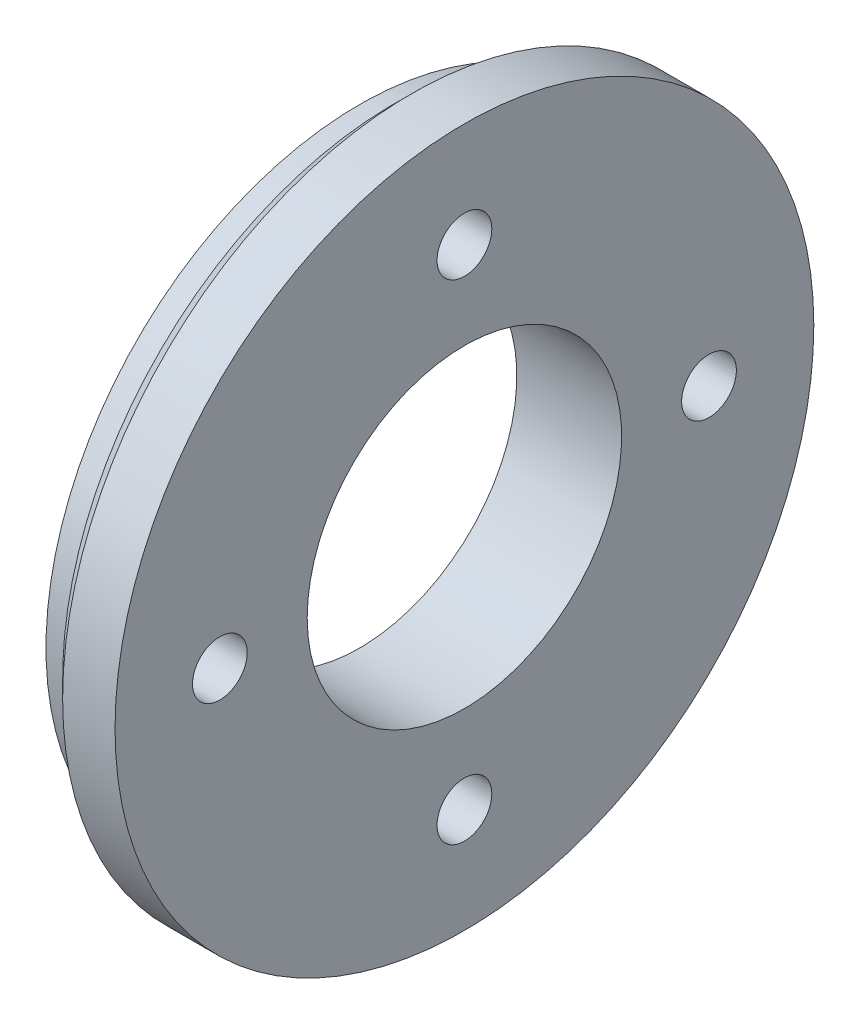
ISO-10303-21;
HEADER;
FILE_DESCRIPTION(('STEP AP214'),'2;1');
FILE_NAME('part.step','',(''),(''),'','','');
FILE_SCHEMA(('AUTOMOTIVE_DESIGN { 1 0 10303 214 1 1 1 1 }'));
ENDSEC;
DATA;
#1=APPLICATION_CONTEXT('core data for automotive mechanical design processes');
#2=APPLICATION_PROTOCOL_DEFINITION('international standard','automotive_design',2000,#1);
#3=PRODUCT_CONTEXT('',#1,'mechanical');
#4=PRODUCT('Part','Part','',(#3));
#5=PRODUCT_RELATED_PRODUCT_CATEGORY('part','',(#4));
#6=PRODUCT_DEFINITION_FORMATION('','',#4);
#7=PRODUCT_DEFINITION_CONTEXT('part definition',#1,'design');
#8=PRODUCT_DEFINITION('design','',#6,#7);
#9=PRODUCT_DEFINITION_SHAPE('','',#8);
#10=(LENGTH_UNIT() NAMED_UNIT(*) SI_UNIT(.MILLI.,.METRE.));
#11=(NAMED_UNIT(*) PLANE_ANGLE_UNIT() SI_UNIT($,.RADIAN.));
#12=(NAMED_UNIT(*) SI_UNIT($,.STERADIAN.) SOLID_ANGLE_UNIT());
#13=UNCERTAINTY_MEASURE_WITH_UNIT(LENGTH_MEASURE(1.E-05),#10,'distance_accuracy_value','');
#14=(GEOMETRIC_REPRESENTATION_CONTEXT(3) GLOBAL_UNCERTAINTY_ASSIGNED_CONTEXT((#13)) GLOBAL_UNIT_ASSIGNED_CONTEXT((#10,
#11,#12)) REPRESENTATION_CONTEXT('',''));
#15=CARTESIAN_POINT('',(0.,0.,0.));
#16=DIRECTION('',(0.,0.,1.));
#17=DIRECTION('',(1.,0.,0.));
#18=AXIS2_PLACEMENT_3D('',#15,#16,#17);
#19=CARTESIAN_POINT('',(-4.7625,0.,0.));
#20=DIRECTION('',(1.,0.,0.));
#21=DIRECTION('',(0.,0.,-1.));
#22=AXIS2_PLACEMENT_3D('',#19,#20,#21);
#23=PLANE('',#22);
#24=CARTESIAN_POINT('',(-4.7625,22.225,0.));
#25=DIRECTION('',(1.,0.,0.));
#26=DIRECTION('',(0.,0.,-1.));
#27=AXIS2_PLACEMENT_3D('',#24,#25,#26);
#28=CIRCLE('',#27,2.4892);
#29=CARTESIAN_POINT('',(-4.7625,22.225,-2.4892));
#30=VERTEX_POINT('',#29);
#31=EDGE_CURVE('E67',#30,#30,#28,.T.);
#32=ORIENTED_EDGE('',*,*,#31,.T.);
#33=EDGE_LOOP('',(#32));
#34=FACE_BOUND('',#33,.T.);
#35=CARTESIAN_POINT('',(-4.7625,0.,22.225));
#36=DIRECTION('',(1.,0.,0.));
#37=DIRECTION('',(0.,0.,-1.));
#38=AXIS2_PLACEMENT_3D('',#35,#36,#37);
#39=CIRCLE('',#38,2.4892);
#40=CARTESIAN_POINT('',(-4.7625,0.,19.7358));
#41=VERTEX_POINT('',#40);
#42=EDGE_CURVE('E85',#41,#41,#39,.T.);
#43=ORIENTED_EDGE('',*,*,#42,.T.);
#44=EDGE_LOOP('',(#43));
#45=FACE_BOUND('',#44,.T.);
#46=CARTESIAN_POINT('',(-4.7625,-22.225,0.));
#47=DIRECTION('',(1.,0.,0.));
#48=DIRECTION('',(0.,0.,-1.));
#49=AXIS2_PLACEMENT_3D('',#46,#47,#48);
#50=CIRCLE('',#49,2.4892);
#51=CARTESIAN_POINT('',(-4.7625,-22.225,-2.4892));
#52=VERTEX_POINT('',#51);
#53=EDGE_CURVE('E79',#52,#52,#50,.T.);
#54=ORIENTED_EDGE('',*,*,#53,.T.);
#55=EDGE_LOOP('',(#54));
#56=FACE_BOUND('',#55,.T.);
#57=CARTESIAN_POINT('',(-4.7625,0.,-22.225));
#58=DIRECTION('',(1.,0.,0.));
#59=DIRECTION('',(0.,0.,-1.));
#60=AXIS2_PLACEMENT_3D('',#57,#58,#59);
#61=CIRCLE('',#60,2.4892);
#62=CARTESIAN_POINT('',(-4.7625,0.,-24.7142));
#63=VERTEX_POINT('',#62);
#64=EDGE_CURVE('E73',#63,#63,#61,.T.);
#65=ORIENTED_EDGE('',*,*,#64,.T.);
#66=EDGE_LOOP('',(#65));
#67=FACE_BOUND('',#66,.T.);
#68=CARTESIAN_POINT('',(-4.7625,0.,0.));
#69=DIRECTION('',(1.,0.,0.));
#70=DIRECTION('',(0.,0.,-1.));
#71=AXIS2_PLACEMENT_3D('',#68,#69,#70);
#72=CIRCLE('',#71,14.2875);
#73=CARTESIAN_POINT('',(-4.7625,0.,14.2875));
#74=VERTEX_POINT('',#73);
#75=EDGE_CURVE('E58',#74,#74,#72,.T.);
#76=ORIENTED_EDGE('',*,*,#75,.T.);
#77=EDGE_LOOP('',(#76));
#78=FACE_BOUND('',#77,.T.);
#79=CARTESIAN_POINT('',(-4.7625,0.,0.));
#80=DIRECTION('',(1.,0.,0.));
#81=DIRECTION('',(0.,0.,-1.));
#82=AXIS2_PLACEMENT_3D('',#79,#80,#81);
#83=CIRCLE('',#82,28.4988);
#84=CARTESIAN_POINT('',(-4.7625,0.,-28.4988));
#85=VERTEX_POINT('',#84);
#86=EDGE_CURVE('E64',#85,#85,#83,.T.);
#87=ORIENTED_EDGE('',*,*,#86,.F.);
#88=EDGE_LOOP('',(#87));
#89=FACE_BOUND('',#88,.T.);
#90=ADVANCED_FACE('F39',(#34,#45,#56,#67,#78,#89),#23,.F.);
#91=CARTESIAN_POINT('',(4.7625,0.,0.));
#92=DIRECTION('',(1.,0.,0.));
#93=DIRECTION('',(0.,0.,-1.));
#94=AXIS2_PLACEMENT_3D('',#91,#92,#93);
#95=PLANE('',#94);
#96=CARTESIAN_POINT('',(4.7625,22.225,0.));
#97=DIRECTION('',(1.,0.,0.));
#98=DIRECTION('',(0.,0.,-1.));
#99=AXIS2_PLACEMENT_3D('',#96,#97,#98);
#100=CIRCLE('',#99,2.4892);
#101=CARTESIAN_POINT('',(4.7625,22.225,-2.4892));
#102=VERTEX_POINT('',#101);
#103=EDGE_CURVE('E88',#102,#102,#100,.T.);
#104=ORIENTED_EDGE('',*,*,#103,.F.);
#105=EDGE_LOOP('',(#104));
#106=FACE_BOUND('',#105,.T.);
#107=CARTESIAN_POINT('',(4.7625,0.,22.225));
#108=DIRECTION('',(1.,0.,0.));
#109=DIRECTION('',(0.,0.,-1.));
#110=AXIS2_PLACEMENT_3D('',#107,#108,#109);
#111=CIRCLE('',#110,2.4892);
#112=CARTESIAN_POINT('',(4.7625,0.,19.7358));
#113=VERTEX_POINT('',#112);
#114=EDGE_CURVE('E82',#113,#113,#111,.T.);
#115=ORIENTED_EDGE('',*,*,#114,.F.);
#116=EDGE_LOOP('',(#115));
#117=FACE_BOUND('',#116,.T.);
#118=CARTESIAN_POINT('',(4.7625,-22.225,0.));
#119=DIRECTION('',(1.,0.,0.));
#120=DIRECTION('',(0.,0.,-1.));
#121=AXIS2_PLACEMENT_3D('',#118,#119,#120);
#122=CIRCLE('',#121,2.4892);
#123=CARTESIAN_POINT('',(4.7625,-22.225,-2.4892));
#124=VERTEX_POINT('',#123);
#125=EDGE_CURVE('E76',#124,#124,#122,.T.);
#126=ORIENTED_EDGE('',*,*,#125,.F.);
#127=EDGE_LOOP('',(#126));
#128=FACE_BOUND('',#127,.T.);
#129=CARTESIAN_POINT('',(4.7625,0.,-22.225));
#130=DIRECTION('',(1.,0.,0.));
#131=DIRECTION('',(0.,0.,-1.));
#132=AXIS2_PLACEMENT_3D('',#129,#130,#131);
#133=CIRCLE('',#132,2.4892);
#134=CARTESIAN_POINT('',(4.7625,0.,-24.7142));
#135=VERTEX_POINT('',#134);
#136=EDGE_CURVE('E70',#135,#135,#133,.T.);
#137=ORIENTED_EDGE('',*,*,#136,.F.);
#138=EDGE_LOOP('',(#137));
#139=FACE_BOUND('',#138,.T.);
#140=CARTESIAN_POINT('',(4.7625,0.,0.));
#141=DIRECTION('',(1.,0.,0.));
#142=DIRECTION('',(0.,0.,-1.));
#143=AXIS2_PLACEMENT_3D('',#140,#141,#142);
#144=CIRCLE('',#143,31.75);
#145=CARTESIAN_POINT('',(4.7625,0.,31.75));
#146=VERTEX_POINT('',#145);
#147=EDGE_CURVE('E51',#146,#146,#144,.T.);
#148=ORIENTED_EDGE('',*,*,#147,.T.);
#149=EDGE_LOOP('',(#148));
#150=FACE_BOUND('',#149,.T.);
#151=CARTESIAN_POINT('',(4.7625,0.,0.));
#152=DIRECTION('',(1.,0.,0.));
#153=DIRECTION('',(0.,0.,-1.));
#154=AXIS2_PLACEMENT_3D('',#151,#152,#153);
#155=CIRCLE('',#154,14.2875);
#156=CARTESIAN_POINT('',(4.7625,0.,14.2875));
#157=VERTEX_POINT('',#156);
#158=EDGE_CURVE('E55',#157,#157,#155,.T.);
#159=ORIENTED_EDGE('',*,*,#158,.F.);
#160=EDGE_LOOP('',(#159));
#161=FACE_BOUND('',#160,.T.);
#162=ADVANCED_FACE('F103',(#106,#117,#128,#139,#150,#161),#95,.T.);
#163=CARTESIAN_POINT('',(4.7625,0.,0.));
#164=DIRECTION('',(-1.,0.,0.));
#165=DIRECTION('',(0.,0.,1.));
#166=AXIS2_PLACEMENT_3D('',#163,#164,#165);
#167=CYLINDRICAL_SURFACE('',#166,31.75);
#168=CARTESIAN_POINT('',(0.,0.,0.));
#169=DIRECTION('',(1.,0.,0.));
#170=DIRECTION('',(0.,0.,-1.));
#171=AXIS2_PLACEMENT_3D('',#168,#169,#170);
#172=CIRCLE('',#171,31.75);
#173=CARTESIAN_POINT('',(0.,0.,31.75));
#174=VERTEX_POINT('',#173);
#175=EDGE_CURVE('E47',#174,#174,#172,.T.);
#176=CARTESIAN_POINT('',(0.,0.,31.75));
#177=CARTESIAN_POINT('',(0.0496093750000188,0.,31.75));
#178=CARTESIAN_POINT('',(0.0992187500000186,0.,31.75));
#179=CARTESIAN_POINT('',(0.198437500000018,0.,31.75));
#180=CARTESIAN_POINT('',(0.248046875000018,0.,31.75));
#181=CARTESIAN_POINT('',(0.347265625000018,0.,31.75));
#182=CARTESIAN_POINT('',(0.396875000000018,0.,31.75));
#183=CARTESIAN_POINT('',(0.496093750000017,0.,31.75));
#184=CARTESIAN_POINT('',(0.545703125000017,0.,31.75));
#185=CARTESIAN_POINT('',(0.644921875000017,0.,31.75));
#186=CARTESIAN_POINT('',(0.694531250000016,0.,31.75));
#187=CARTESIAN_POINT('',(0.793750000000016,0.,31.75));
#188=CARTESIAN_POINT('',(0.843359375000015,0.,31.75));
#189=CARTESIAN_POINT('',(0.942578125000015,0.,31.75));
#190=CARTESIAN_POINT('',(0.992187500000015,0.,31.75));
#191=CARTESIAN_POINT('',(1.09140625000001,0.,31.75));
#192=CARTESIAN_POINT('',(1.14101562500001,0.,31.75));
#193=CARTESIAN_POINT('',(1.24023437500001,0.,31.75));
#194=CARTESIAN_POINT('',(1.28984375000001,0.,31.75));
#195=CARTESIAN_POINT('',(1.38906250000001,0.,31.75));
#196=CARTESIAN_POINT('',(1.43867187500001,0.,31.75));
#197=CARTESIAN_POINT('',(1.53789062500001,0.,31.75));
#198=CARTESIAN_POINT('',(1.58750000000001,0.,31.75));
#199=CARTESIAN_POINT('',(1.68671875000001,0.,31.75));
#200=CARTESIAN_POINT('',(1.73632812500001,0.,31.75));
#201=CARTESIAN_POINT('',(1.83554687500001,0.,31.75));
#202=CARTESIAN_POINT('',(1.88515625000001,0.,31.75));
#203=CARTESIAN_POINT('',(1.98437500000001,0.,31.75));
#204=CARTESIAN_POINT('',(2.03398437500001,0.,31.75));
#205=CARTESIAN_POINT('',(2.13320312500001,0.,31.75));
#206=CARTESIAN_POINT('',(2.18281250000001,0.,31.75));
#207=CARTESIAN_POINT('',(2.28203125000001,0.,31.75));
#208=CARTESIAN_POINT('',(2.33164062500001,0.,31.75));
#209=CARTESIAN_POINT('',(2.43085937500001,0.,31.75));
#210=CARTESIAN_POINT('',(2.48046875000001,0.,31.75));
#211=CARTESIAN_POINT('',(2.57968750000001,0.,31.75));
#212=CARTESIAN_POINT('',(2.62929687500001,0.,31.75));
#213=CARTESIAN_POINT('',(2.72851562500001,0.,31.75));
#214=CARTESIAN_POINT('',(2.77812500000001,0.,31.75));
#215=CARTESIAN_POINT('',(2.87734375000001,0.,31.75));
#216=CARTESIAN_POINT('',(2.92695312500001,0.,31.75));
#217=CARTESIAN_POINT('',(3.02617187500001,0.,31.75));
#218=CARTESIAN_POINT('',(3.07578125000001,0.,31.75));
#219=CARTESIAN_POINT('',(3.17500000000001,0.,31.75));
#220=CARTESIAN_POINT('',(3.22460937500001,0.,31.75));
#221=CARTESIAN_POINT('',(3.32382812500001,0.,31.75));
#222=CARTESIAN_POINT('',(3.3734375,0.,31.75));
#223=CARTESIAN_POINT('',(3.47265625,0.,31.75));
#224=CARTESIAN_POINT('',(3.522265625,0.,31.75));
#225=CARTESIAN_POINT('',(3.621484375,0.,31.75));
#226=CARTESIAN_POINT('',(3.67109375,0.,31.75));
#227=CARTESIAN_POINT('',(3.7703125,0.,31.75));
#228=CARTESIAN_POINT('',(3.819921875,0.,31.75));
#229=CARTESIAN_POINT('',(3.919140625,0.,31.75));
#230=CARTESIAN_POINT('',(3.96875,0.,31.75));
#231=CARTESIAN_POINT('',(4.06796875,0.,31.75));
#232=CARTESIAN_POINT('',(4.117578125,0.,31.75));
#233=CARTESIAN_POINT('',(4.216796875,0.,31.75));
#234=CARTESIAN_POINT('',(4.26640625,0.,31.75));
#235=CARTESIAN_POINT('',(4.365625,0.,31.75));
#236=CARTESIAN_POINT('',(4.415234375,0.,31.75));
#237=CARTESIAN_POINT('',(4.514453125,0.,31.75));
#238=CARTESIAN_POINT('',(4.5640625,0.,31.75));
#239=CARTESIAN_POINT('',(4.66328125,0.,31.75));
#240=CARTESIAN_POINT('',(4.712890625,0.,31.75));
#241=CARTESIAN_POINT('',(4.7625,0.,31.75));
#242=B_SPLINE_CURVE_WITH_KNOTS('',3,(#176,#177,#178,#179,#180,#181,#182,#183,#184,#185,#186,
#187,#188,#189,#190,#191,#192,#193,#194,#195,#196,#197,#198,#199,#200,#201,#202,#203,#204,#205,
#206,#207,#208,#209,#210,#211,#212,#213,#214,#215,#216,#217,#218,#219,#220,#221,#222,#223,#224,
#225,#226,#227,#228,#229,#230,#231,#232,#233,#234,#235,#236,#237,#238,#239,#240,#241),
.UNSPECIFIED.,.F.,.F.,(4,2,2,2,2,2,2,2,2,2,2,2,2,2,2,2,2,2,2,2,2,2,2,2,2,2,2,2,2,2,2,2,4),(0.,
0.148828124999999,0.297656249999998,0.446484374999999,0.595312499999998,0.744140624999997,
0.892968749999996,1.041796875,1.190625,1.33945312499999,1.48828124999999,1.63710937499999,
1.78593749999999,1.93476562499999,2.08359374999999,2.23242187499999,2.38124999999999,
2.53007812499999,2.67890624999999,2.82773437499999,2.97656249999999,3.12539062499999,
3.27421874999999,3.42304687499999,3.57187499999998,3.72070312499998,3.86953124999998,
4.01835937499998,4.16718749999998,4.31601562499998,4.46484374999998,4.61367187499998,
4.76249999999998),.UNSPECIFIED.);
#243=EDGE_CURVE('BSEAM106',#174,#146,#242,.T.);
#244=ORIENTED_EDGE('',*,*,#175,.T.);
#245=ORIENTED_EDGE('',*,*,#147,.F.);
#246=ORIENTED_EDGE('',*,*,#243,.T.);
#247=ORIENTED_EDGE('',*,*,#243,.F.);
#248=EDGE_LOOP('',(#244,#246,#245,#247));
#249=FACE_BOUND('',#248,.T.);
#250=ADVANCED_FACE('F106',(#249),#167,.T.);
#251=CARTESIAN_POINT('',(4.7625,0.,0.));
#252=DIRECTION('',(-1.,0.,0.));
#253=DIRECTION('',(0.,0.,1.));
#254=AXIS2_PLACEMENT_3D('',#251,#252,#253);
#255=CYLINDRICAL_SURFACE('',#254,14.2875);
#256=CARTESIAN_POINT('',(4.7625,0.,14.2875));
#257=CARTESIAN_POINT('',(4.66328125,0.,14.2875));
#258=CARTESIAN_POINT('',(4.5640625,0.,14.2875));
#259=CARTESIAN_POINT('',(4.365625,0.,14.2875));
#260=CARTESIAN_POINT('',(4.26640625,0.,14.2875));
#261=CARTESIAN_POINT('',(4.06796875,0.,14.2875));
#262=CARTESIAN_POINT('',(3.96875,0.,14.2875));
#263=CARTESIAN_POINT('',(3.7703125,0.,14.2875));
#264=CARTESIAN_POINT('',(3.67109375,0.,14.2875));
#265=CARTESIAN_POINT('',(3.47265625,0.,14.2875));
#266=CARTESIAN_POINT('',(3.3734375,0.,14.2875));
#267=CARTESIAN_POINT('',(3.175,0.,14.2875));
#268=CARTESIAN_POINT('',(3.07578125,0.,14.2875));
#269=CARTESIAN_POINT('',(2.87734375,0.,14.2875));
#270=CARTESIAN_POINT('',(2.778125,0.,14.2875));
#271=CARTESIAN_POINT('',(2.5796875,0.,14.2875));
#272=CARTESIAN_POINT('',(2.48046875,0.,14.2875));
#273=CARTESIAN_POINT('',(2.28203125,0.,14.2875));
#274=CARTESIAN_POINT('',(2.1828125,0.,14.2875));
#275=CARTESIAN_POINT('',(1.984375,0.,14.2875));
#276=CARTESIAN_POINT('',(1.88515625,0.,14.2875));
#277=CARTESIAN_POINT('',(1.68671875,0.,14.2875));
#278=CARTESIAN_POINT('',(1.5875,0.,14.2875));
#279=CARTESIAN_POINT('',(1.3890625,0.,14.2875));
#280=CARTESIAN_POINT('',(1.28984375,0.,14.2875));
#281=CARTESIAN_POINT('',(1.09140625,0.,14.2875));
#282=CARTESIAN_POINT('',(0.992187499999999,0.,14.2875));
#283=CARTESIAN_POINT('',(0.79375,0.,14.2875));
#284=CARTESIAN_POINT('',(0.69453125,0.,14.2875));
#285=CARTESIAN_POINT('',(0.49609375,0.,14.2875));
#286=CARTESIAN_POINT('',(0.396875,0.,14.2875));
#287=CARTESIAN_POINT('',(0.1984375,0.,14.2875));
#288=CARTESIAN_POINT('',(0.0992187500000001,0.,14.2875));
#289=CARTESIAN_POINT('',(-0.0992187500000001,0.,14.2875));
#290=CARTESIAN_POINT('',(-0.1984375,0.,14.2875));
#291=CARTESIAN_POINT('',(-0.396875,0.,14.2875));
#292=CARTESIAN_POINT('',(-0.49609375,0.,14.2875));
#293=CARTESIAN_POINT('',(-0.69453125,0.,14.2875));
#294=CARTESIAN_POINT('',(-0.793750000000001,0.,14.2875));
#295=CARTESIAN_POINT('',(-0.992187500000001,0.,14.2875));
#296=CARTESIAN_POINT('',(-1.09140625,0.,14.2875));
#297=CARTESIAN_POINT('',(-1.28984375,0.,14.2875));
#298=CARTESIAN_POINT('',(-1.3890625,0.,14.2875));
#299=CARTESIAN_POINT('',(-1.5875,0.,14.2875));
#300=CARTESIAN_POINT('',(-1.68671875,0.,14.2875));
#301=CARTESIAN_POINT('',(-1.88515625,0.,14.2875));
#302=CARTESIAN_POINT('',(-1.984375,0.,14.2875));
#303=CARTESIAN_POINT('',(-2.1828125,0.,14.2875));
#304=CARTESIAN_POINT('',(-2.28203125,0.,14.2875));
#305=CARTESIAN_POINT('',(-2.48046875,0.,14.2875));
#306=CARTESIAN_POINT('',(-2.5796875,0.,14.2875));
#307=CARTESIAN_POINT('',(-2.778125,0.,14.2875));
#308=CARTESIAN_POINT('',(-2.87734375,0.,14.2875));
#309=CARTESIAN_POINT('',(-3.07578125,0.,14.2875));
#310=CARTESIAN_POINT('',(-3.175,0.,14.2875));
#311=CARTESIAN_POINT('',(-3.3734375,0.,14.2875));
#312=CARTESIAN_POINT('',(-3.47265625,0.,14.2875));
#313=CARTESIAN_POINT('',(-3.67109375,0.,14.2875));
#314=CARTESIAN_POINT('',(-3.7703125,0.,14.2875));
#315=CARTESIAN_POINT('',(-3.96875,0.,14.2875));
#316=CARTESIAN_POINT('',(-4.06796875,0.,14.2875));
#317=CARTESIAN_POINT('',(-4.26640625,0.,14.2875));
#318=CARTESIAN_POINT('',(-4.365625,0.,14.2875));
#319=CARTESIAN_POINT('',(-4.5640625,0.,14.2875));
#320=CARTESIAN_POINT('',(-4.66328125,0.,14.2875));
#321=CARTESIAN_POINT('',(-4.7625,0.,14.2875));
#322=B_SPLINE_CURVE_WITH_KNOTS('',3,(#256,#257,#258,#259,#260,#261,#262,#263,#264,#265,#266,
#267,#268,#269,#270,#271,#272,#273,#274,#275,#276,#277,#278,#279,#280,#281,#282,#283,#284,#285,
#286,#287,#288,#289,#290,#291,#292,#293,#294,#295,#296,#297,#298,#299,#300,#301,#302,#303,#304,
#305,#306,#307,#308,#309,#310,#311,#312,#313,#314,#315,#316,#317,#318,#319,#320,#321),
.UNSPECIFIED.,.F.,.F.,(4,2,2,2,2,2,2,2,2,2,2,2,2,2,2,2,2,2,2,2,2,2,2,2,2,2,2,2,2,2,2,2,4),(0.,
0.29765625,0.5953125,0.892968750000001,1.190625,1.48828125,1.7859375,2.08359375,2.38125,
2.67890625,2.9765625,3.27421875,3.571875,3.86953125,4.1671875,4.46484375,4.7625,5.06015625,
5.3578125,5.65546875,5.953125,6.25078125,6.5484375,6.84609375,7.14375,7.44140625,7.7390625,
8.03671875,8.334375,8.63203125,8.9296875,9.22734375,9.525),.UNSPECIFIED.);
#323=EDGE_CURVE('BSEAM118',#157,#74,#322,.T.);
#324=ORIENTED_EDGE('',*,*,#158,.T.);
#325=ORIENTED_EDGE('',*,*,#75,.F.);
#326=ORIENTED_EDGE('',*,*,#323,.T.);
#327=ORIENTED_EDGE('',*,*,#323,.F.);
#328=EDGE_LOOP('',(#324,#326,#325,#327));
#329=FACE_BOUND('',#328,.T.);
#330=ADVANCED_FACE('F118',(#329),#255,.F.);
#331=CARTESIAN_POINT('',(-1.5875,0.,0.));
#332=DIRECTION('',(1.,0.,0.));
#333=DIRECTION('',(0.,0.,-1.));
#334=AXIS2_PLACEMENT_3D('',#331,#332,#333);
#335=PLANE('',#334);
#336=CARTESIAN_POINT('',(-1.5875,0.,0.));
#337=DIRECTION('',(1.,0.,0.));
#338=DIRECTION('',(0.,0.,-1.));
#339=AXIS2_PLACEMENT_3D('',#336,#337,#338);
#340=CIRCLE('',#339,30.1625);
#341=CARTESIAN_POINT('',(-1.5875,0.,-30.1625));
#342=VERTEX_POINT('',#341);
#343=EDGE_CURVE('E10',#342,#342,#340,.F.);
#344=ORIENTED_EDGE('',*,*,#343,.T.);
#345=EDGE_LOOP('',(#344));
#346=FACE_BOUND('',#345,.T.);
#347=CARTESIAN_POINT('',(-1.5875,0.,0.));
#348=DIRECTION('',(1.,0.,0.));
#349=DIRECTION('',(0.,0.,-1.));
#350=AXIS2_PLACEMENT_3D('',#347,#348,#349);
#351=CIRCLE('',#350,28.4988);
#352=CARTESIAN_POINT('',(-1.5875,0.,-28.4988));
#353=VERTEX_POINT('',#352);
#354=EDGE_CURVE('E61',#353,#353,#351,.T.);
#355=ORIENTED_EDGE('',*,*,#354,.T.);
#356=EDGE_LOOP('',(#355));
#357=FACE_BOUND('',#356,.T.);
#358=ADVANCED_FACE('F121',(#346,#357),#335,.F.);
#359=CARTESIAN_POINT('',(-1.5875,0.,0.));
#360=DIRECTION('',(-1.,0.,0.));
#361=DIRECTION('',(0.,0.,1.));
#362=AXIS2_PLACEMENT_3D('',#359,#360,#361);
#363=CYLINDRICAL_SURFACE('',#362,28.4988);
#364=ORIENTED_EDGE('',*,*,#354,.F.);
#365=EDGE_LOOP('',(#364));
#366=FACE_BOUND('',#365,.T.);
#367=ORIENTED_EDGE('',*,*,#86,.T.);
#368=EDGE_LOOP('',(#367));
#369=FACE_BOUND('',#368,.T.);
#370=ADVANCED_FACE('F130',(#366,#369),#363,.T.);
#371=CARTESIAN_POINT('',(-4.7625,0.,-22.225));
#372=DIRECTION('',(1.,0.,0.));
#373=DIRECTION('',(0.,0.,-1.));
#374=AXIS2_PLACEMENT_3D('',#371,#372,#373);
#375=CYLINDRICAL_SURFACE('',#374,2.4892);
#376=CARTESIAN_POINT('',(-4.7625,0.,-24.7142));
#377=CARTESIAN_POINT('',(-4.66328125,0.,-24.7142));
#378=CARTESIAN_POINT('',(-4.5640625,0.,-24.7142));
#379=CARTESIAN_POINT('',(-4.365625,0.,-24.7142));
#380=CARTESIAN_POINT('',(-4.26640625,0.,-24.7142));
#381=CARTESIAN_POINT('',(-4.06796875,0.,-24.7142));
#382=CARTESIAN_POINT('',(-3.96875,0.,-24.7142));
#383=CARTESIAN_POINT('',(-3.7703125,0.,-24.7142));
#384=CARTESIAN_POINT('',(-3.67109375,0.,-24.7142));
#385=CARTESIAN_POINT('',(-3.47265625,0.,-24.7142));
#386=CARTESIAN_POINT('',(-3.3734375,0.,-24.7142));
#387=CARTESIAN_POINT('',(-3.175,0.,-24.7142));
#388=CARTESIAN_POINT('',(-3.07578125,0.,-24.7142));
#389=CARTESIAN_POINT('',(-2.87734375,0.,-24.7142));
#390=CARTESIAN_POINT('',(-2.778125,0.,-24.7142));
#391=CARTESIAN_POINT('',(-2.5796875,0.,-24.7142));
#392=CARTESIAN_POINT('',(-2.48046875,0.,-24.7142));
#393=CARTESIAN_POINT('',(-2.28203125,0.,-24.7142));
#394=CARTESIAN_POINT('',(-2.1828125,0.,-24.7142));
#395=CARTESIAN_POINT('',(-1.984375,0.,-24.7142));
#396=CARTESIAN_POINT('',(-1.88515625,0.,-24.7142));
#397=CARTESIAN_POINT('',(-1.68671875,0.,-24.7142));
#398=CARTESIAN_POINT('',(-1.5875,0.,-24.7142));
#399=CARTESIAN_POINT('',(-1.3890625,0.,-24.7142));
#400=CARTESIAN_POINT('',(-1.28984375,0.,-24.7142));
#401=CARTESIAN_POINT('',(-1.09140625,0.,-24.7142));
#402=CARTESIAN_POINT('',(-0.9921875,0.,-24.7142));
#403=CARTESIAN_POINT('',(-0.793750000000001,0.,-24.7142));
#404=CARTESIAN_POINT('',(-0.694531250000001,0.,-24.7142));
#405=CARTESIAN_POINT('',(-0.496093750000001,0.,-24.7142));
#406=CARTESIAN_POINT('',(-0.396875000000001,0.,-24.7142));
#407=CARTESIAN_POINT('',(-0.198437500000001,0.,-24.7142));
#408=CARTESIAN_POINT('',(-0.0992187500000009,0.,-24.7142));
#409=CARTESIAN_POINT('',(0.0992187499999992,0.,-24.7142));
#410=CARTESIAN_POINT('',(0.198437499999999,0.,-24.7142));
#411=CARTESIAN_POINT('',(0.396874999999999,0.,-24.7142));
#412=CARTESIAN_POINT('',(0.496093749999999,0.,-24.7142));
#413=CARTESIAN_POINT('',(0.694531249999999,0.,-24.7142));
#414=CARTESIAN_POINT('',(0.79375,0.,-24.7142));
#415=CARTESIAN_POINT('',(0.9921875,0.,-24.7142));
#416=CARTESIAN_POINT('',(1.09140625,0.,-24.7142));
#417=CARTESIAN_POINT('',(1.28984375,0.,-24.7142));
#418=CARTESIAN_POINT('',(1.3890625,0.,-24.7142));
#419=CARTESIAN_POINT('',(1.5875,0.,-24.7142));
#420=CARTESIAN_POINT('',(1.68671875,0.,-24.7142));
#421=CARTESIAN_POINT('',(1.88515625,0.,-24.7142));
#422=CARTESIAN_POINT('',(1.984375,0.,-24.7142));
#423=CARTESIAN_POINT('',(2.1828125,0.,-24.7142));
#424=CARTESIAN_POINT('',(2.28203125,0.,-24.7142));
#425=CARTESIAN_POINT('',(2.48046875,0.,-24.7142));
#426=CARTESIAN_POINT('',(2.5796875,0.,-24.7142));
#427=CARTESIAN_POINT('',(2.778125,0.,-24.7142));
#428=CARTESIAN_POINT('',(2.87734375,0.,-24.7142));
#429=CARTESIAN_POINT('',(3.07578125,0.,-24.7142));
#430=CARTESIAN_POINT('',(3.175,0.,-24.7142));
#431=CARTESIAN_POINT('',(3.3734375,0.,-24.7142));
#432=CARTESIAN_POINT('',(3.47265625,0.,-24.7142));
#433=CARTESIAN_POINT('',(3.67109375,0.,-24.7142));
#434=CARTESIAN_POINT('',(3.7703125,0.,-24.7142));
#435=CARTESIAN_POINT('',(3.96875,0.,-24.7142));
#436=CARTESIAN_POINT('',(4.06796875,0.,-24.7142));
#437=CARTESIAN_POINT('',(4.26640625,0.,-24.7142));
#438=CARTESIAN_POINT('',(4.365625,0.,-24.7142));
#439=CARTESIAN_POINT('',(4.5640625,0.,-24.7142));
#440=CARTESIAN_POINT('',(4.66328125,0.,-24.7142));
#441=CARTESIAN_POINT('',(4.7625,0.,-24.7142));
#442=B_SPLINE_CURVE_WITH_KNOTS('',3,(#376,#377,#378,#379,#380,#381,#382,#383,#384,#385,#386,
#387,#388,#389,#390,#391,#392,#393,#394,#395,#396,#397,#398,#399,#400,#401,#402,#403,#404,#405,
#406,#407,#408,#409,#410,#411,#412,#413,#414,#415,#416,#417,#418,#419,#420,#421,#422,#423,#424,
#425,#426,#427,#428,#429,#430,#431,#432,#433,#434,#435,#436,#437,#438,#439,#440,#441),
.UNSPECIFIED.,.F.,.F.,(4,2,2,2,2,2,2,2,2,2,2,2,2,2,2,2,2,2,2,2,2,2,2,2,2,2,2,2,2,2,2,2,4),(0.,
0.29765625,0.5953125,0.892968750000001,1.190625,1.48828125,1.7859375,2.08359375,2.38125,
2.67890625,2.9765625,3.27421875,3.571875,3.86953125,4.1671875,4.46484375,4.7625,5.06015625,
5.3578125,5.65546875,5.953125,6.25078125,6.5484375,6.84609375,7.14375,7.44140625,7.7390625,
8.03671875,8.334375,8.63203125,8.9296875,9.22734375,9.525),.UNSPECIFIED.);
#443=EDGE_CURVE('BSEAM132',#63,#135,#442,.T.);
#444=ORIENTED_EDGE('',*,*,#64,.F.);
#445=ORIENTED_EDGE('',*,*,#136,.T.);
#446=ORIENTED_EDGE('',*,*,#443,.T.);
#447=ORIENTED_EDGE('',*,*,#443,.F.);
#448=EDGE_LOOP('',(#444,#446,#445,#447));
#449=FACE_BOUND('',#448,.T.);
#450=ADVANCED_FACE('F132',(#449),#375,.F.);
#451=CARTESIAN_POINT('',(-4.7625,-22.225,0.));
#452=DIRECTION('',(1.,0.,0.));
#453=DIRECTION('',(0.,0.,-1.));
#454=AXIS2_PLACEMENT_3D('',#451,#452,#453);
#455=CYLINDRICAL_SURFACE('',#454,2.4892);
#456=CARTESIAN_POINT('',(-4.7625,-22.225,-2.4892));
#457=CARTESIAN_POINT('',(-4.66328125,-22.225,-2.4892));
#458=CARTESIAN_POINT('',(-4.5640625,-22.225,-2.4892));
#459=CARTESIAN_POINT('',(-4.365625,-22.225,-2.4892));
#460=CARTESIAN_POINT('',(-4.26640625,-22.225,-2.4892));
#461=CARTESIAN_POINT('',(-4.06796875,-22.225,-2.4892));
#462=CARTESIAN_POINT('',(-3.96875,-22.225,-2.4892));
#463=CARTESIAN_POINT('',(-3.7703125,-22.225,-2.4892));
#464=CARTESIAN_POINT('',(-3.67109375,-22.225,-2.4892));
#465=CARTESIAN_POINT('',(-3.47265625,-22.225,-2.4892));
#466=CARTESIAN_POINT('',(-3.3734375,-22.225,-2.4892));
#467=CARTESIAN_POINT('',(-3.175,-22.225,-2.4892));
#468=CARTESIAN_POINT('',(-3.07578125,-22.225,-2.4892));
#469=CARTESIAN_POINT('',(-2.87734375,-22.225,-2.4892));
#470=CARTESIAN_POINT('',(-2.778125,-22.225,-2.4892));
#471=CARTESIAN_POINT('',(-2.5796875,-22.225,-2.4892));
#472=CARTESIAN_POINT('',(-2.48046875,-22.225,-2.4892));
#473=CARTESIAN_POINT('',(-2.28203125,-22.225,-2.4892));
#474=CARTESIAN_POINT('',(-2.1828125,-22.225,-2.4892));
#475=CARTESIAN_POINT('',(-1.984375,-22.225,-2.4892));
#476=CARTESIAN_POINT('',(-1.88515625,-22.225,-2.4892));
#477=CARTESIAN_POINT('',(-1.68671875,-22.225,-2.4892));
#478=CARTESIAN_POINT('',(-1.5875,-22.225,-2.4892));
#479=CARTESIAN_POINT('',(-1.3890625,-22.225,-2.4892));
#480=CARTESIAN_POINT('',(-1.28984375,-22.225,-2.4892));
#481=CARTESIAN_POINT('',(-1.09140625,-22.225,-2.4892));
#482=CARTESIAN_POINT('',(-0.9921875,-22.225,-2.4892));
#483=CARTESIAN_POINT('',(-0.793750000000001,-22.225,-2.4892));
#484=CARTESIAN_POINT('',(-0.694531250000001,-22.225,-2.4892));
#485=CARTESIAN_POINT('',(-0.496093750000001,-22.225,-2.4892));
#486=CARTESIAN_POINT('',(-0.396875000000001,-22.225,-2.4892));
#487=CARTESIAN_POINT('',(-0.198437500000001,-22.225,-2.4892));
#488=CARTESIAN_POINT('',(-0.0992187500000009,-22.225,-2.4892));
#489=CARTESIAN_POINT('',(0.0992187499999992,-22.225,-2.4892));
#490=CARTESIAN_POINT('',(0.198437499999999,-22.225,-2.4892));
#491=CARTESIAN_POINT('',(0.396874999999999,-22.225,-2.4892));
#492=CARTESIAN_POINT('',(0.496093749999999,-22.225,-2.4892));
#493=CARTESIAN_POINT('',(0.694531249999999,-22.225,-2.4892));
#494=CARTESIAN_POINT('',(0.79375,-22.225,-2.4892));
#495=CARTESIAN_POINT('',(0.9921875,-22.225,-2.4892));
#496=CARTESIAN_POINT('',(1.09140625,-22.225,-2.4892));
#497=CARTESIAN_POINT('',(1.28984375,-22.225,-2.4892));
#498=CARTESIAN_POINT('',(1.3890625,-22.225,-2.4892));
#499=CARTESIAN_POINT('',(1.5875,-22.225,-2.4892));
#500=CARTESIAN_POINT('',(1.68671875,-22.225,-2.4892));
#501=CARTESIAN_POINT('',(1.88515625,-22.225,-2.4892));
#502=CARTESIAN_POINT('',(1.984375,-22.225,-2.4892));
#503=CARTESIAN_POINT('',(2.1828125,-22.225,-2.4892));
#504=CARTESIAN_POINT('',(2.28203125,-22.225,-2.4892));
#505=CARTESIAN_POINT('',(2.48046875,-22.225,-2.4892));
#506=CARTESIAN_POINT('',(2.5796875,-22.225,-2.4892));
#507=CARTESIAN_POINT('',(2.778125,-22.225,-2.4892));
#508=CARTESIAN_POINT('',(2.87734375,-22.225,-2.4892));
#509=CARTESIAN_POINT('',(3.07578125,-22.225,-2.4892));
#510=CARTESIAN_POINT('',(3.175,-22.225,-2.4892));
#511=CARTESIAN_POINT('',(3.3734375,-22.225,-2.4892));
#512=CARTESIAN_POINT('',(3.47265625,-22.225,-2.4892));
#513=CARTESIAN_POINT('',(3.67109375,-22.225,-2.4892));
#514=CARTESIAN_POINT('',(3.7703125,-22.225,-2.4892));
#515=CARTESIAN_POINT('',(3.96875,-22.225,-2.4892));
#516=CARTESIAN_POINT('',(4.06796875,-22.225,-2.4892));
#517=CARTESIAN_POINT('',(4.26640625,-22.225,-2.4892));
#518=CARTESIAN_POINT('',(4.365625,-22.225,-2.4892));
#519=CARTESIAN_POINT('',(4.5640625,-22.225,-2.4892));
#520=CARTESIAN_POINT('',(4.66328125,-22.225,-2.4892));
#521=CARTESIAN_POINT('',(4.7625,-22.225,-2.4892));
#522=B_SPLINE_CURVE_WITH_KNOTS('',3,(#456,#457,#458,#459,#460,#461,#462,#463,#464,#465,#466,
#467,#468,#469,#470,#471,#472,#473,#474,#475,#476,#477,#478,#479,#480,#481,#482,#483,#484,#485,
#486,#487,#488,#489,#490,#491,#492,#493,#494,#495,#496,#497,#498,#499,#500,#501,#502,#503,#504,
#505,#506,#507,#508,#509,#510,#511,#512,#513,#514,#515,#516,#517,#518,#519,#520,#521),
.UNSPECIFIED.,.F.,.F.,(4,2,2,2,2,2,2,2,2,2,2,2,2,2,2,2,2,2,2,2,2,2,2,2,2,2,2,2,2,2,2,2,4),(0.,
0.29765625,0.5953125,0.892968750000001,1.190625,1.48828125,1.7859375,2.08359375,2.38125,
2.67890625,2.9765625,3.27421875,3.571875,3.86953125,4.1671875,4.46484375,4.7625,5.06015625,
5.3578125,5.65546875,5.953125,6.25078125,6.5484375,6.84609375,7.14375,7.44140625,7.7390625,
8.03671875,8.334375,8.63203125,8.9296875,9.22734375,9.525),.UNSPECIFIED.);
#523=EDGE_CURVE('BSEAM139',#52,#124,#522,.T.);
#524=ORIENTED_EDGE('',*,*,#53,.F.);
#525=ORIENTED_EDGE('',*,*,#125,.T.);
#526=ORIENTED_EDGE('',*,*,#523,.T.);
#527=ORIENTED_EDGE('',*,*,#523,.F.);
#528=EDGE_LOOP('',(#524,#526,#525,#527));
#529=FACE_BOUND('',#528,.T.);
#530=ADVANCED_FACE('F139',(#529),#455,.F.);
#531=CARTESIAN_POINT('',(-4.7625,0.,22.225));
#532=DIRECTION('',(1.,0.,0.));
#533=DIRECTION('',(0.,0.,-1.));
#534=AXIS2_PLACEMENT_3D('',#531,#532,#533);
#535=CYLINDRICAL_SURFACE('',#534,2.4892);
#536=CARTESIAN_POINT('',(-4.7625,0.,19.7358));
#537=CARTESIAN_POINT('',(-4.66328125,0.,19.7358));
#538=CARTESIAN_POINT('',(-4.5640625,0.,19.7358));
#539=CARTESIAN_POINT('',(-4.365625,0.,19.7358));
#540=CARTESIAN_POINT('',(-4.26640625,0.,19.7358));
#541=CARTESIAN_POINT('',(-4.06796875,0.,19.7358));
#542=CARTESIAN_POINT('',(-3.96875,0.,19.7358));
#543=CARTESIAN_POINT('',(-3.7703125,0.,19.7358));
#544=CARTESIAN_POINT('',(-3.67109375,0.,19.7358));
#545=CARTESIAN_POINT('',(-3.47265625,0.,19.7358));
#546=CARTESIAN_POINT('',(-3.3734375,0.,19.7358));
#547=CARTESIAN_POINT('',(-3.175,0.,19.7358));
#548=CARTESIAN_POINT('',(-3.07578125,0.,19.7358));
#549=CARTESIAN_POINT('',(-2.87734375,0.,19.7358));
#550=CARTESIAN_POINT('',(-2.778125,0.,19.7358));
#551=CARTESIAN_POINT('',(-2.5796875,0.,19.7358));
#552=CARTESIAN_POINT('',(-2.48046875,0.,19.7358));
#553=CARTESIAN_POINT('',(-2.28203125,0.,19.7358));
#554=CARTESIAN_POINT('',(-2.1828125,0.,19.7358));
#555=CARTESIAN_POINT('',(-1.984375,0.,19.7358));
#556=CARTESIAN_POINT('',(-1.88515625,0.,19.7358));
#557=CARTESIAN_POINT('',(-1.68671875,0.,19.7358));
#558=CARTESIAN_POINT('',(-1.5875,0.,19.7358));
#559=CARTESIAN_POINT('',(-1.3890625,0.,19.7358));
#560=CARTESIAN_POINT('',(-1.28984375,0.,19.7358));
#561=CARTESIAN_POINT('',(-1.09140625,0.,19.7358));
#562=CARTESIAN_POINT('',(-0.9921875,0.,19.7358));
#563=CARTESIAN_POINT('',(-0.793750000000001,0.,19.7358));
#564=CARTESIAN_POINT('',(-0.694531250000001,0.,19.7358));
#565=CARTESIAN_POINT('',(-0.496093750000001,0.,19.7358));
#566=CARTESIAN_POINT('',(-0.396875000000001,0.,19.7358));
#567=CARTESIAN_POINT('',(-0.198437500000001,0.,19.7358));
#568=CARTESIAN_POINT('',(-0.0992187500000009,0.,19.7358));
#569=CARTESIAN_POINT('',(0.0992187499999992,0.,19.7358));
#570=CARTESIAN_POINT('',(0.198437499999999,0.,19.7358));
#571=CARTESIAN_POINT('',(0.396874999999999,0.,19.7358));
#572=CARTESIAN_POINT('',(0.496093749999999,0.,19.7358));
#573=CARTESIAN_POINT('',(0.694531249999999,0.,19.7358));
#574=CARTESIAN_POINT('',(0.79375,0.,19.7358));
#575=CARTESIAN_POINT('',(0.9921875,0.,19.7358));
#576=CARTESIAN_POINT('',(1.09140625,0.,19.7358));
#577=CARTESIAN_POINT('',(1.28984375,0.,19.7358));
#578=CARTESIAN_POINT('',(1.3890625,0.,19.7358));
#579=CARTESIAN_POINT('',(1.5875,0.,19.7358));
#580=CARTESIAN_POINT('',(1.68671875,0.,19.7358));
#581=CARTESIAN_POINT('',(1.88515625,0.,19.7358));
#582=CARTESIAN_POINT('',(1.984375,0.,19.7358));
#583=CARTESIAN_POINT('',(2.1828125,0.,19.7358));
#584=CARTESIAN_POINT('',(2.28203125,0.,19.7358));
#585=CARTESIAN_POINT('',(2.48046875,0.,19.7358));
#586=CARTESIAN_POINT('',(2.5796875,0.,19.7358));
#587=CARTESIAN_POINT('',(2.778125,0.,19.7358));
#588=CARTESIAN_POINT('',(2.87734375,0.,19.7358));
#589=CARTESIAN_POINT('',(3.07578125,0.,19.7358));
#590=CARTESIAN_POINT('',(3.175,0.,19.7358));
#591=CARTESIAN_POINT('',(3.3734375,0.,19.7358));
#592=CARTESIAN_POINT('',(3.47265625,0.,19.7358));
#593=CARTESIAN_POINT('',(3.67109375,0.,19.7358));
#594=CARTESIAN_POINT('',(3.7703125,0.,19.7358));
#595=CARTESIAN_POINT('',(3.96875,0.,19.7358));
#596=CARTESIAN_POINT('',(4.06796875,0.,19.7358));
#597=CARTESIAN_POINT('',(4.26640625,0.,19.7358));
#598=CARTESIAN_POINT('',(4.365625,0.,19.7358));
#599=CARTESIAN_POINT('',(4.5640625,0.,19.7358));
#600=CARTESIAN_POINT('',(4.66328125,0.,19.7358));
#601=CARTESIAN_POINT('',(4.7625,0.,19.7358));
#602=B_SPLINE_CURVE_WITH_KNOTS('',3,(#536,#537,#538,#539,#540,#541,#542,#543,#544,#545,#546,
#547,#548,#549,#550,#551,#552,#553,#554,#555,#556,#557,#558,#559,#560,#561,#562,#563,#564,#565,
#566,#567,#568,#569,#570,#571,#572,#573,#574,#575,#576,#577,#578,#579,#580,#581,#582,#583,#584,
#585,#586,#587,#588,#589,#590,#591,#592,#593,#594,#595,#596,#597,#598,#599,#600,#601),
.UNSPECIFIED.,.F.,.F.,(4,2,2,2,2,2,2,2,2,2,2,2,2,2,2,2,2,2,2,2,2,2,2,2,2,2,2,2,2,2,2,2,4),(0.,
0.29765625,0.5953125,0.892968750000001,1.190625,1.48828125,1.7859375,2.08359375,2.38125,
2.67890625,2.9765625,3.27421875,3.571875,3.86953125,4.1671875,4.46484375,4.7625,5.06015625,
5.3578125,5.65546875,5.953125,6.25078125,6.5484375,6.84609375,7.14375,7.44140625,7.7390625,
8.03671875,8.334375,8.63203125,8.9296875,9.22734375,9.525),.UNSPECIFIED.);
#603=EDGE_CURVE('BSEAM99',#41,#113,#602,.T.);
#604=ORIENTED_EDGE('',*,*,#42,.F.);
#605=ORIENTED_EDGE('',*,*,#114,.T.);
#606=ORIENTED_EDGE('',*,*,#603,.T.);
#607=ORIENTED_EDGE('',*,*,#603,.F.);
#608=EDGE_LOOP('',(#604,#606,#605,#607));
#609=FACE_BOUND('',#608,.T.);
#610=ADVANCED_FACE('F99',(#609),#535,.F.);
#611=CARTESIAN_POINT('',(-4.7625,22.225,0.));
#612=DIRECTION('',(1.,0.,0.));
#613=DIRECTION('',(0.,0.,-1.));
#614=AXIS2_PLACEMENT_3D('',#611,#612,#613);
#615=CYLINDRICAL_SURFACE('',#614,2.4892);
#616=CARTESIAN_POINT('',(-4.7625,22.225,-2.4892));
#617=CARTESIAN_POINT('',(-4.66328125,22.225,-2.4892));
#618=CARTESIAN_POINT('',(-4.5640625,22.225,-2.4892));
#619=CARTESIAN_POINT('',(-4.365625,22.225,-2.4892));
#620=CARTESIAN_POINT('',(-4.26640625,22.225,-2.4892));
#621=CARTESIAN_POINT('',(-4.06796875,22.225,-2.4892));
#622=CARTESIAN_POINT('',(-3.96875,22.225,-2.4892));
#623=CARTESIAN_POINT('',(-3.7703125,22.225,-2.4892));
#624=CARTESIAN_POINT('',(-3.67109375,22.225,-2.4892));
#625=CARTESIAN_POINT('',(-3.47265625,22.225,-2.4892));
#626=CARTESIAN_POINT('',(-3.3734375,22.225,-2.4892));
#627=CARTESIAN_POINT('',(-3.175,22.225,-2.4892));
#628=CARTESIAN_POINT('',(-3.07578125,22.225,-2.4892));
#629=CARTESIAN_POINT('',(-2.87734375,22.225,-2.4892));
#630=CARTESIAN_POINT('',(-2.778125,22.225,-2.4892));
#631=CARTESIAN_POINT('',(-2.5796875,22.225,-2.4892));
#632=CARTESIAN_POINT('',(-2.48046875,22.225,-2.4892));
#633=CARTESIAN_POINT('',(-2.28203125,22.225,-2.4892));
#634=CARTESIAN_POINT('',(-2.1828125,22.225,-2.4892));
#635=CARTESIAN_POINT('',(-1.984375,22.225,-2.4892));
#636=CARTESIAN_POINT('',(-1.88515625,22.225,-2.4892));
#637=CARTESIAN_POINT('',(-1.68671875,22.225,-2.4892));
#638=CARTESIAN_POINT('',(-1.5875,22.225,-2.4892));
#639=CARTESIAN_POINT('',(-1.3890625,22.225,-2.4892));
#640=CARTESIAN_POINT('',(-1.28984375,22.225,-2.4892));
#641=CARTESIAN_POINT('',(-1.09140625,22.225,-2.4892));
#642=CARTESIAN_POINT('',(-0.9921875,22.225,-2.4892));
#643=CARTESIAN_POINT('',(-0.793750000000001,22.225,-2.4892));
#644=CARTESIAN_POINT('',(-0.694531250000001,22.225,-2.4892));
#645=CARTESIAN_POINT('',(-0.496093750000001,22.225,-2.4892));
#646=CARTESIAN_POINT('',(-0.396875000000001,22.225,-2.4892));
#647=CARTESIAN_POINT('',(-0.198437500000001,22.225,-2.4892));
#648=CARTESIAN_POINT('',(-0.0992187500000009,22.225,-2.4892));
#649=CARTESIAN_POINT('',(0.0992187499999992,22.225,-2.4892));
#650=CARTESIAN_POINT('',(0.198437499999999,22.225,-2.4892));
#651=CARTESIAN_POINT('',(0.396874999999999,22.225,-2.4892));
#652=CARTESIAN_POINT('',(0.496093749999999,22.225,-2.4892));
#653=CARTESIAN_POINT('',(0.694531249999999,22.225,-2.4892));
#654=CARTESIAN_POINT('',(0.79375,22.225,-2.4892));
#655=CARTESIAN_POINT('',(0.9921875,22.225,-2.4892));
#656=CARTESIAN_POINT('',(1.09140625,22.225,-2.4892));
#657=CARTESIAN_POINT('',(1.28984375,22.225,-2.4892));
#658=CARTESIAN_POINT('',(1.3890625,22.225,-2.4892));
#659=CARTESIAN_POINT('',(1.5875,22.225,-2.4892));
#660=CARTESIAN_POINT('',(1.68671875,22.225,-2.4892));
#661=CARTESIAN_POINT('',(1.88515625,22.225,-2.4892));
#662=CARTESIAN_POINT('',(1.984375,22.225,-2.4892));
#663=CARTESIAN_POINT('',(2.1828125,22.225,-2.4892));
#664=CARTESIAN_POINT('',(2.28203125,22.225,-2.4892));
#665=CARTESIAN_POINT('',(2.48046875,22.225,-2.4892));
#666=CARTESIAN_POINT('',(2.5796875,22.225,-2.4892));
#667=CARTESIAN_POINT('',(2.778125,22.225,-2.4892));
#668=CARTESIAN_POINT('',(2.87734375,22.225,-2.4892));
#669=CARTESIAN_POINT('',(3.07578125,22.225,-2.4892));
#670=CARTESIAN_POINT('',(3.175,22.225,-2.4892));
#671=CARTESIAN_POINT('',(3.3734375,22.225,-2.4892));
#672=CARTESIAN_POINT('',(3.47265625,22.225,-2.4892));
#673=CARTESIAN_POINT('',(3.67109375,22.225,-2.4892));
#674=CARTESIAN_POINT('',(3.7703125,22.225,-2.4892));
#675=CARTESIAN_POINT('',(3.96875,22.225,-2.4892));
#676=CARTESIAN_POINT('',(4.06796875,22.225,-2.4892));
#677=CARTESIAN_POINT('',(4.26640625,22.225,-2.4892));
#678=CARTESIAN_POINT('',(4.365625,22.225,-2.4892));
#679=CARTESIAN_POINT('',(4.5640625,22.225,-2.4892));
#680=CARTESIAN_POINT('',(4.66328125,22.225,-2.4892));
#681=CARTESIAN_POINT('',(4.7625,22.225,-2.4892));
#682=B_SPLINE_CURVE_WITH_KNOTS('',3,(#616,#617,#618,#619,#620,#621,#622,#623,#624,#625,#626,
#627,#628,#629,#630,#631,#632,#633,#634,#635,#636,#637,#638,#639,#640,#641,#642,#643,#644,#645,
#646,#647,#648,#649,#650,#651,#652,#653,#654,#655,#656,#657,#658,#659,#660,#661,#662,#663,#664,
#665,#666,#667,#668,#669,#670,#671,#672,#673,#674,#675,#676,#677,#678,#679,#680,#681),
.UNSPECIFIED.,.F.,.F.,(4,2,2,2,2,2,2,2,2,2,2,2,2,2,2,2,2,2,2,2,2,2,2,2,2,2,2,2,2,2,2,2,4),(0.,
0.29765625,0.5953125,0.892968750000001,1.190625,1.48828125,1.7859375,2.08359375,2.38125,
2.67890625,2.9765625,3.27421875,3.571875,3.86953125,4.1671875,4.46484375,4.7625,5.06015625,
5.3578125,5.65546875,5.953125,6.25078125,6.5484375,6.84609375,7.14375,7.44140625,7.7390625,
8.03671875,8.334375,8.63203125,8.9296875,9.22734375,9.525),.UNSPECIFIED.);
#683=EDGE_CURVE('BSEAM96',#30,#102,#682,.T.);
#684=ORIENTED_EDGE('',*,*,#31,.F.);
#685=ORIENTED_EDGE('',*,*,#103,.T.);
#686=ORIENTED_EDGE('',*,*,#683,.T.);
#687=ORIENTED_EDGE('',*,*,#683,.F.);
#688=EDGE_LOOP('',(#684,#686,#685,#687));
#689=FACE_BOUND('',#688,.T.);
#690=ADVANCED_FACE('F96',(#689),#615,.F.);
#691=CARTESIAN_POINT('',(0.,0.,0.));
#692=DIRECTION('',(1.,0.,0.));
#693=DIRECTION('',(0.,0.,-1.));
#694=AXIS2_PLACEMENT_3D('',#691,#692,#693);
#695=CONICAL_SURFACE('',#694,31.75,0.785398163397446);
#696=ORIENTED_EDGE('',*,*,#343,.F.);
#697=EDGE_LOOP('',(#696));
#698=FACE_BOUND('',#697,.T.);
#699=ORIENTED_EDGE('',*,*,#175,.F.);
#700=EDGE_LOOP('',(#699));
#701=FACE_BOUND('',#700,.T.);
#702=ADVANCED_FACE('F42',(#698,#701),#695,.T.);
#703=CLOSED_SHELL('',(#90,#162,#250,#330,#358,#370,#450,#530,#610,#690,#702));
#704=MANIFOLD_SOLID_BREP('B2',#703);
#705=ADVANCED_BREP_SHAPE_REPRESENTATION('',(#18,#704),#14);
#706=SHAPE_DEFINITION_REPRESENTATION(#9,#705);
ENDSEC;
END-ISO-10303-21;
